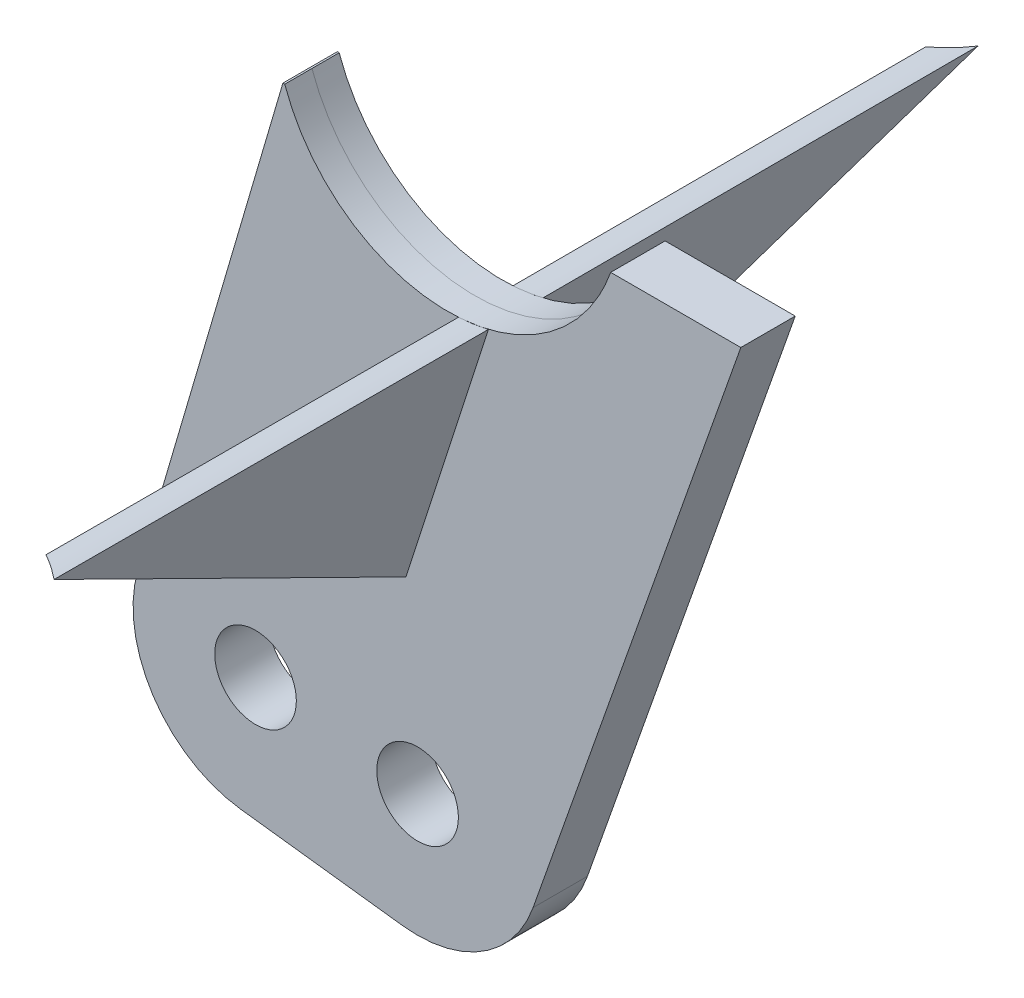
ISO-10303-21;
HEADER;
FILE_DESCRIPTION(('STEP AP214'),'2;1');
FILE_NAME('part.step','',(''),(''),'','','');
FILE_SCHEMA(('AUTOMOTIVE_DESIGN { 1 0 10303 214 1 1 1 1 }'));
ENDSEC;
DATA;
#1=APPLICATION_CONTEXT('core data for automotive mechanical design processes');
#2=APPLICATION_PROTOCOL_DEFINITION('international standard','automotive_design',2000,#1);
#3=PRODUCT_CONTEXT('',#1,'mechanical');
#4=PRODUCT('Part','Part','',(#3));
#5=PRODUCT_RELATED_PRODUCT_CATEGORY('part','',(#4));
#6=PRODUCT_DEFINITION_FORMATION('','',#4);
#7=PRODUCT_DEFINITION_CONTEXT('part definition',#1,'design');
#8=PRODUCT_DEFINITION('design','',#6,#7);
#9=PRODUCT_DEFINITION_SHAPE('','',#8);
#10=(LENGTH_UNIT() NAMED_UNIT(*) SI_UNIT(.MILLI.,.METRE.));
#11=(NAMED_UNIT(*) PLANE_ANGLE_UNIT() SI_UNIT($,.RADIAN.));
#12=(NAMED_UNIT(*) SI_UNIT($,.STERADIAN.) SOLID_ANGLE_UNIT());
#13=UNCERTAINTY_MEASURE_WITH_UNIT(LENGTH_MEASURE(1.E-05),#10,'distance_accuracy_value','');
#14=(GEOMETRIC_REPRESENTATION_CONTEXT(3) GLOBAL_UNCERTAINTY_ASSIGNED_CONTEXT((#13)) GLOBAL_UNIT_ASSIGNED_CONTEXT((#10,
#11,#12)) REPRESENTATION_CONTEXT('',''));
#15=CARTESIAN_POINT('',(0.,0.,0.));
#16=DIRECTION('',(0.,0.,1.));
#17=DIRECTION('',(1.,0.,0.));
#18=AXIS2_PLACEMENT_3D('',#15,#16,#17);
#19=CARTESIAN_POINT('',(0.,675.36294581158,2.));
#20=DIRECTION('',(0.,-1.,0.));
#21=DIRECTION('',(0.,0.,-1.));
#22=AXIS2_PLACEMENT_3D('',#19,#20,#21);
#23=PLANE('',#22);
#24=CARTESIAN_POINT('',(773.707143369989,675.36294581158,-2117.85708999697));
#25=DIRECTION('',(0.,-1.,0.));
#26=DIRECTION('',(0.,0.,1.));
#27=AXIS2_PLACEMENT_3D('',#24,#25,#26);
#28=ELLIPSE('',#27,6375.56571395792,12.7);
#29=CARTESIAN_POINT('',(785.684567710527,675.36294581158,2.));
#30=VERTEX_POINT('',#29);
#31=CARTESIAN_POINT('',(785.685971534854,675.36294581158,-1.54501167224955E-13));
#32=VERTEX_POINT('',#31);
#33=EDGE_CURVE('E59',#30,#32,#28,.F.);
#34=ORIENTED_EDGE('',*,*,#33,.F.);
#35=DIRECTION('',(-1.,0.,0.));
#36=VECTOR('',#35,1.);
#37=CARTESIAN_POINT('',(0.,675.36294581158,2.));
#38=LINE('',#37,#36);
#39=CARTESIAN_POINT('',(795.250475327084,675.36294581158,2.));
#40=VERTEX_POINT('',#39);
#41=EDGE_CURVE('E178',#40,#30,#38,.T.);
#42=ORIENTED_EDGE('',*,*,#41,.F.);
#43=DIRECTION('',(0.,0.,-1.));
#44=VECTOR('',#43,1.);
#45=CARTESIAN_POINT('',(795.250475327084,675.36294581158,2.));
#46=LINE('',#45,#44);
#47=CARTESIAN_POINT('',(795.250475327084,675.36294581158,-2.));
#48=VERTEX_POINT('',#47);
#49=EDGE_CURVE('E141',#40,#48,#46,.T.);
#50=ORIENTED_EDGE('',*,*,#49,.T.);
#51=DIRECTION('',(-1.,0.,0.));
#52=VECTOR('',#51,1.);
#53=CARTESIAN_POINT('',(0.,675.36294581158,-2.));
#54=LINE('',#53,#52);
#55=CARTESIAN_POINT('',(785.684567710527,675.36294581158,-2.));
#56=VERTEX_POINT('',#55);
#57=EDGE_CURVE('E53',#48,#56,#54,.T.);
#58=ORIENTED_EDGE('',*,*,#57,.T.);
#59=CARTESIAN_POINT('',(773.707143369989,675.36294581158,2117.85708999691));
#60=DIRECTION('',(0.,-1.,0.));
#61=DIRECTION('',(0.,0.,1.));
#62=AXIS2_PLACEMENT_3D('',#59,#60,#61);
#63=ELLIPSE('',#62,6375.56571395792,12.7);
#64=EDGE_CURVE('E116',#32,#56,#63,.F.);
#65=ORIENTED_EDGE('',*,*,#64,.F.);
#66=EDGE_LOOP('',(#34,#42,#50,#58,#65));
#67=FACE_BOUND('',#66,.T.);
#68=ADVANCED_FACE('F50',(#67),#23,.F.);
#69=CARTESIAN_POINT('',(761.728315205146,675.36294581158,0.));
#70=VERTEX_POINT('',#69);
#71=CARTESIAN_POINT('',(761.729719029473,675.36294581158,2.));
#72=VERTEX_POINT('',#71);
#73=EDGE_CURVE('E12',#70,#72,#28,.F.);
#74=ORIENTED_EDGE('',*,*,#73,.F.);
#75=CARTESIAN_POINT('',(761.729719029473,675.36294581158,-2.));
#76=VERTEX_POINT('',#75);
#77=EDGE_CURVE('E128',#76,#70,#63,.F.);
#78=ORIENTED_EDGE('',*,*,#77,.F.);
#79=CARTESIAN_POINT('',(761.593469884298,675.36294581158,-2.));
#80=VERTEX_POINT('',#79);
#81=EDGE_CURVE('E136',#76,#80,#54,.T.);
#82=ORIENTED_EDGE('',*,*,#81,.T.);
#83=DIRECTION('',(0.,0.,-1.));
#84=VECTOR('',#83,1.);
#85=CARTESIAN_POINT('',(761.593469884298,675.36294581158,2.));
#86=LINE('',#85,#84);
#87=CARTESIAN_POINT('',(761.593469884298,675.36294581158,2.));
#88=VERTEX_POINT('',#87);
#89=EDGE_CURVE('E148',#88,#80,#86,.T.);
#90=ORIENTED_EDGE('',*,*,#89,.F.);
#91=EDGE_CURVE('E182',#72,#88,#38,.T.);
#92=ORIENTED_EDGE('',*,*,#91,.F.);
#93=EDGE_LOOP('',(#74,#78,#82,#90,#92));
#94=FACE_BOUND('',#93,.T.);
#95=ADVANCED_FACE('F202',(#94),#23,.F.);
#96=CARTESIAN_POINT('',(759.582806759763,636.529342027402,2.));
#97=DIRECTION('',(0.,0.,-1.));
#98=DIRECTION('',(-1.,0.,0.));
#99=AXIS2_PLACEMENT_3D('',#96,#97,#98);
#100=CYLINDRICAL_SURFACE('',#99,9.00000000000004);
#101=CARTESIAN_POINT('',(759.582806759763,636.529342027402,-2.));
#102=DIRECTION('',(0.,0.,1.));
#103=DIRECTION('',(1.,0.,0.));
#104=AXIS2_PLACEMENT_3D('',#101,#102,#103);
#105=CIRCLE('',#104,9.00000000000004);
#106=CARTESIAN_POINT('',(750.946601349752,639.06231579673,-2.));
#107=VERTEX_POINT('',#106);
#108=CARTESIAN_POINT('',(758.485982669116,627.59642666263,-2.));
#109=VERTEX_POINT('',#108);
#110=EDGE_CURVE('E142',#107,#109,#105,.T.);
#111=ORIENTED_EDGE('',*,*,#110,.T.);
#112=DIRECTION('',(0.,0.,-1.));
#113=VECTOR('',#112,1.);
#114=CARTESIAN_POINT('',(758.485982669116,627.59642666263,2.));
#115=LINE('',#114,#113);
#116=CARTESIAN_POINT('',(758.485982669116,627.59642666263,2.));
#117=VERTEX_POINT('',#116);
#118=EDGE_CURVE('E166',#117,#109,#115,.T.);
#119=ORIENTED_EDGE('',*,*,#118,.F.);
#120=CARTESIAN_POINT('',(759.582806759763,636.529342027402,2.));
#121=DIRECTION('',(0.,0.,1.));
#122=DIRECTION('',(1.,0.,0.));
#123=AXIS2_PLACEMENT_3D('',#120,#121,#122);
#124=CIRCLE('',#123,9.00000000000004);
#125=CARTESIAN_POINT('',(750.946601349752,639.06231579673,2.));
#126=VERTEX_POINT('',#125);
#127=EDGE_CURVE('E181',#126,#117,#124,.T.);
#128=ORIENTED_EDGE('',*,*,#127,.F.);
#129=DIRECTION('',(0.,0.,-1.));
#130=VECTOR('',#129,1.);
#131=CARTESIAN_POINT('',(750.946601349752,639.06231579673,2.));
#132=LINE('',#131,#130);
#133=EDGE_CURVE('E153',#126,#107,#132,.T.);
#134=ORIENTED_EDGE('',*,*,#133,.T.);
#135=EDGE_LOOP('',(#111,#119,#128,#134));
#136=FACE_BOUND('',#135,.T.);
#137=ADVANCED_FACE('F209',(#136),#100,.T.);
#138=CARTESIAN_POINT('',(87.179796227402,710.022461996271,2.));
#139=DIRECTION('',(-0.121869343405135,-0.992546151641324,0.));
#140=DIRECTION('',(0.992546151641324,-0.121869343405135,0.));
#141=AXIS2_PLACEMENT_3D('',#138,#139,#140);
#142=PLANE('',#141);
#143=DIRECTION('',(-0.992546151641324,0.121869343405135,0.));
#144=VECTOR('',#143,1.);
#145=CARTESIAN_POINT('',(87.179796227402,710.022461996271,-2.));
#146=LINE('',#145,#144);
#147=CARTESIAN_POINT('',(770.396536488812,626.133994541769,-2.));
#148=VERTEX_POINT('',#147);
#149=EDGE_CURVE('E167',#148,#109,#146,.T.);
#150=ORIENTED_EDGE('',*,*,#149,.F.);
#151=DIRECTION('',(0.,0.,-1.));
#152=VECTOR('',#151,1.);
#153=CARTESIAN_POINT('',(770.396536488812,626.133994541769,2.));
#154=LINE('',#153,#152);
#155=CARTESIAN_POINT('',(770.396536488812,626.133994541769,2.));
#156=VERTEX_POINT('',#155);
#157=EDGE_CURVE('E163',#156,#148,#154,.T.);
#158=ORIENTED_EDGE('',*,*,#157,.F.);
#159=DIRECTION('',(-0.992546151641324,0.121869343405135,0.));
#160=VECTOR('',#159,1.);
#161=CARTESIAN_POINT('',(87.179796227402,710.022461996271,2.));
#162=LINE('',#161,#160);
#163=EDGE_CURVE('E156',#156,#117,#162,.T.);
#164=ORIENTED_EDGE('',*,*,#163,.T.);
#165=ORIENTED_EDGE('',*,*,#118,.T.);
#166=EDGE_LOOP('',(#150,#158,#164,#165));
#167=FACE_BOUND('',#166,.T.);
#168=ADVANCED_FACE('F215',(#167),#142,.T.);
#169=CARTESIAN_POINT('',(771.493360579459,635.06690990654,2.));
#170=DIRECTION('',(0.,0.,-1.));
#171=DIRECTION('',(-1.,0.,0.));
#172=AXIS2_PLACEMENT_3D('',#169,#170,#171);
#173=CYLINDRICAL_SURFACE('',#172,9.00000000000004);
#174=CARTESIAN_POINT('',(771.493360579459,635.06690990654,-2.));
#175=DIRECTION('',(0.,0.,1.));
#176=DIRECTION('',(1.,0.,0.));
#177=AXIS2_PLACEMENT_3D('',#174,#175,#176);
#178=CIRCLE('',#177,9.00000000000004);
#179=CARTESIAN_POINT('',(779.980834721333,632.073119217295,-2.));
#180=VERTEX_POINT('',#179);
#181=EDGE_CURVE('E164',#148,#180,#178,.T.);
#182=ORIENTED_EDGE('',*,*,#181,.T.);
#183=DIRECTION('',(0.,0.,-1.));
#184=VECTOR('',#183,1.);
#185=CARTESIAN_POINT('',(779.980834721333,632.073119217295,2.));
#186=LINE('',#185,#184);
#187=CARTESIAN_POINT('',(779.980834721333,632.073119217295,2.));
#188=VERTEX_POINT('',#187);
#189=EDGE_CURVE('E146',#188,#180,#186,.T.);
#190=ORIENTED_EDGE('',*,*,#189,.F.);
#191=CARTESIAN_POINT('',(771.493360579459,635.06690990654,2.));
#192=DIRECTION('',(0.,0.,1.));
#193=DIRECTION('',(1.,0.,0.));
#194=AXIS2_PLACEMENT_3D('',#191,#192,#193);
#195=CIRCLE('',#194,9.00000000000004);
#196=EDGE_CURVE('E184',#156,#188,#195,.T.);
#197=ORIENTED_EDGE('',*,*,#196,.F.);
#198=ORIENTED_EDGE('',*,*,#157,.T.);
#199=EDGE_LOOP('',(#182,#190,#197,#198));
#200=FACE_BOUND('',#199,.T.);
#201=ADVANCED_FACE('F218',(#200),#173,.T.);
#202=CARTESIAN_POINT('',(495.393175778991,-174.740264579522,2.));
#203=DIRECTION('',(-0.943052682430485,0.332643409916184,0.));
#204=DIRECTION('',(-0.332643409916184,-0.943052682430485,0.));
#205=AXIS2_PLACEMENT_3D('',#202,#203,#204);
#206=PLANE('',#205);
#207=DIRECTION('',(0.332643409916184,0.943052682430485,0.));
#208=VECTOR('',#207,1.);
#209=CARTESIAN_POINT('',(495.393175778991,-174.740264579522,-2.));
#210=LINE('',#209,#208);
#211=EDGE_CURVE('E161',#180,#48,#210,.T.);
#212=ORIENTED_EDGE('',*,*,#211,.T.);
#213=ORIENTED_EDGE('',*,*,#49,.F.);
#214=DIRECTION('',(0.332643409916184,0.943052682430485,0.));
#215=VECTOR('',#214,1.);
#216=CARTESIAN_POINT('',(495.393175778991,-174.740264579522,2.));
#217=LINE('',#216,#215);
#218=EDGE_CURVE('E170',#188,#40,#217,.T.);
#219=ORIENTED_EDGE('',*,*,#218,.F.);
#220=ORIENTED_EDGE('',*,*,#189,.T.);
#221=EDGE_LOOP('',(#212,#213,#219,#220));
#222=FACE_BOUND('',#221,.T.);
#223=ADVANCED_FACE('F222',(#222),#206,.F.);
#224=CARTESIAN_POINT('',(518.876123985577,-152.184848459354,2.));
#225=DIRECTION('',(0.959578378890051,-0.281441529925386,0.));
#226=DIRECTION('',(0.281441529925386,0.959578378890051,0.));
#227=AXIS2_PLACEMENT_3D('',#224,#225,#226);
#228=PLANE('',#227);
#229=DIRECTION('',(-0.281441529925386,-0.959578378890051,0.));
#230=VECTOR('',#229,1.);
#231=CARTESIAN_POINT('',(518.876123985577,-152.184848459354,-2.));
#232=LINE('',#231,#230);
#233=EDGE_CURVE('E152',#80,#107,#232,.T.);
#234=ORIENTED_EDGE('',*,*,#233,.T.);
#235=ORIENTED_EDGE('',*,*,#133,.F.);
#236=DIRECTION('',(-0.281441529925386,-0.959578378890051,0.));
#237=VECTOR('',#236,1.);
#238=CARTESIAN_POINT('',(518.876123985577,-152.184848459354,2.));
#239=LINE('',#238,#237);
#240=EDGE_CURVE('E179',#88,#126,#239,.T.);
#241=ORIENTED_EDGE('',*,*,#240,.F.);
#242=ORIENTED_EDGE('',*,*,#89,.T.);
#243=EDGE_LOOP('',(#234,#235,#241,#242));
#244=FACE_BOUND('',#243,.T.);
#245=ADVANCED_FACE('F204',(#244),#228,.F.);
#246=CARTESIAN_POINT('',(759.582806759763,636.529342027402,2.));
#247=DIRECTION('',(0.,0.,-1.));
#248=DIRECTION('',(-1.,0.,0.));
#249=AXIS2_PLACEMENT_3D('',#246,#247,#248);
#250=CYLINDRICAL_SURFACE('',#249,3.00000000000005);
#251=CARTESIAN_POINT('',(759.582806759763,636.529342027402,2.));
#252=DIRECTION('',(0.,0.,1.));
#253=DIRECTION('',(1.,0.,0.));
#254=AXIS2_PLACEMENT_3D('',#251,#252,#253);
#255=CIRCLE('',#254,3.00000000000005);
#256=CARTESIAN_POINT('',(762.582806759763,636.529342027402,2.));
#257=VERTEX_POINT('',#256);
#258=EDGE_CURVE('E151',#257,#257,#255,.T.);
#259=ORIENTED_EDGE('',*,*,#258,.T.);
#260=EDGE_LOOP('',(#259));
#261=FACE_BOUND('',#260,.T.);
#262=CARTESIAN_POINT('',(759.582806759763,636.529342027402,-2.));
#263=DIRECTION('',(0.,0.,1.));
#264=DIRECTION('',(1.,0.,0.));
#265=AXIS2_PLACEMENT_3D('',#262,#263,#264);
#266=CIRCLE('',#265,3.00000000000005);
#267=CARTESIAN_POINT('',(762.582806759763,636.529342027402,-2.));
#268=VERTEX_POINT('',#267);
#269=EDGE_CURVE('E159',#268,#268,#266,.T.);
#270=ORIENTED_EDGE('',*,*,#269,.F.);
#271=EDGE_LOOP('',(#270));
#272=FACE_BOUND('',#271,.T.);
#273=ADVANCED_FACE('F244',(#261,#272),#250,.F.);
#274=CARTESIAN_POINT('',(771.493360579459,635.06690990654,2.));
#275=DIRECTION('',(0.,0.,-1.));
#276=DIRECTION('',(-1.,0.,0.));
#277=AXIS2_PLACEMENT_3D('',#274,#275,#276);
#278=CYLINDRICAL_SURFACE('',#277,3.00000000000005);
#279=CARTESIAN_POINT('',(771.493360579459,635.06690990654,2.));
#280=DIRECTION('',(0.,0.,1.));
#281=DIRECTION('',(1.,0.,0.));
#282=AXIS2_PLACEMENT_3D('',#279,#280,#281);
#283=CIRCLE('',#282,3.00000000000005);
#284=CARTESIAN_POINT('',(774.493360579459,635.06690990654,2.));
#285=VERTEX_POINT('',#284);
#286=EDGE_CURVE('E175',#285,#285,#283,.T.);
#287=ORIENTED_EDGE('',*,*,#286,.T.);
#288=EDGE_LOOP('',(#287));
#289=FACE_BOUND('',#288,.T.);
#290=CARTESIAN_POINT('',(771.493360579459,635.06690990654,-2.));
#291=DIRECTION('',(0.,0.,1.));
#292=DIRECTION('',(1.,0.,0.));
#293=AXIS2_PLACEMENT_3D('',#290,#291,#292);
#294=CIRCLE('',#293,3.00000000000005);
#295=CARTESIAN_POINT('',(774.493360579459,635.06690990654,-2.));
#296=VERTEX_POINT('',#295);
#297=EDGE_CURVE('E126',#296,#296,#294,.T.);
#298=ORIENTED_EDGE('',*,*,#297,.F.);
#299=EDGE_LOOP('',(#298));
#300=FACE_BOUND('',#299,.T.);
#301=ADVANCED_FACE('F252',(#289,#300),#278,.F.);
#302=CARTESIAN_POINT('',(0.,0.,2.));
#303=DIRECTION('',(0.,0.,1.));
#304=DIRECTION('',(1.,0.,0.));
#305=AXIS2_PLACEMENT_3D('',#302,#303,#304);
#306=PLANE('',#305);
#307=ORIENTED_EDGE('',*,*,#258,.F.);
#308=EDGE_LOOP('',(#307));
#309=FACE_BOUND('',#308,.T.);
#310=ORIENTED_EDGE('',*,*,#41,.T.);
#311=CARTESIAN_POINT('',(773.70714337,679.585667318095,2.));
#312=DIRECTION('',(0.,0.,1.));
#313=DIRECTION('',(2.57561310605937E-12,1.,0.));
#314=AXIS2_PLACEMENT_3D('',#311,#312,#313);
#315=ELLIPSE('',#314,12.7000251967778,12.7);
#316=EDGE_CURVE('E66',#30,#72,#315,.F.);
#317=ORIENTED_EDGE('',*,*,#316,.T.);
#318=ORIENTED_EDGE('',*,*,#91,.T.);
#319=ORIENTED_EDGE('',*,*,#240,.T.);
#320=ORIENTED_EDGE('',*,*,#127,.T.);
#321=ORIENTED_EDGE('',*,*,#163,.F.);
#322=ORIENTED_EDGE('',*,*,#196,.T.);
#323=ORIENTED_EDGE('',*,*,#218,.T.);
#324=EDGE_LOOP('',(#310,#317,#318,#319,#320,#321,#322,#323));
#325=FACE_BOUND('',#324,.T.);
#326=ORIENTED_EDGE('',*,*,#286,.F.);
#327=EDGE_LOOP('',(#326));
#328=FACE_BOUND('',#327,.T.);
#329=ADVANCED_FACE('F196',(#309,#325,#328),#306,.T.);
#330=CARTESIAN_POINT('',(0.,0.,-2.));
#331=DIRECTION('',(0.,0.,1.));
#332=DIRECTION('',(1.,0.,0.));
#333=AXIS2_PLACEMENT_3D('',#330,#331,#332);
#334=PLANE('',#333);
#335=CARTESIAN_POINT('',(773.70714337,679.585667318095,-2.));
#336=DIRECTION('',(0.,0.,1.));
#337=DIRECTION('',(-2.57551970347908E-12,-1.,0.));
#338=AXIS2_PLACEMENT_3D('',#335,#336,#337);
#339=ELLIPSE('',#338,12.7000251967778,12.7);
#340=EDGE_CURVE('E120',#56,#76,#339,.F.);
#341=ORIENTED_EDGE('',*,*,#340,.F.);
#342=ORIENTED_EDGE('',*,*,#57,.F.);
#343=ORIENTED_EDGE('',*,*,#211,.F.);
#344=ORIENTED_EDGE('',*,*,#181,.F.);
#345=ORIENTED_EDGE('',*,*,#149,.T.);
#346=ORIENTED_EDGE('',*,*,#110,.F.);
#347=ORIENTED_EDGE('',*,*,#233,.F.);
#348=ORIENTED_EDGE('',*,*,#81,.F.);
#349=EDGE_LOOP('',(#341,#342,#343,#344,#345,#346,#347,#348));
#350=FACE_BOUND('',#349,.T.);
#351=ORIENTED_EDGE('',*,*,#269,.T.);
#352=EDGE_LOOP('',(#351));
#353=FACE_BOUND('',#352,.T.);
#354=ORIENTED_EDGE('',*,*,#297,.T.);
#355=EDGE_LOOP('',(#354));
#356=FACE_BOUND('',#355,.T.);
#357=ADVANCED_FACE('F132',(#350,#353,#356),#334,.F.);
#358=CARTESIAN_POINT('',(773.707143370001,679.840323836785,-129.840641592359));
#359=DIRECTION('',(0.,-0.0019919800955382,0.999998016005682));
#360=DIRECTION('',(0.,-0.999998016005682,-0.0019919800955382));
#361=AXIS2_PLACEMENT_3D('',#358,#359,#360);
#362=CYLINDRICAL_SURFACE('',#361,12.7);
#363=ORIENTED_EDGE('',*,*,#64,.T.);
#364=ORIENTED_EDGE('',*,*,#340,.T.);
#365=ORIENTED_EDGE('',*,*,#77,.T.);
#366=CARTESIAN_POINT('',(773.70714337,679.58168335,0.));
#367=DIRECTION('',(0.,0.,1.));
#368=DIRECTION('',(-7.3888044120618E-12,-1.,0.));
#369=AXIS2_PLACEMENT_3D('',#366,#367,#368);
#370=ELLIPSE('',#369,12.7000251967778,12.7);
#371=EDGE_CURVE('E123',#70,#32,#370,.T.);
#372=ORIENTED_EDGE('',*,*,#371,.T.);
#373=EDGE_LOOP('',(#363,#364,#365,#372));
#374=FACE_BOUND('',#373,.T.);
#375=ADVANCED_FACE('F118',(#374),#362,.F.);
#376=CARTESIAN_POINT('',(773.70714337,679.58168335,0.));
#377=DIRECTION('',(0.,0.0019919800955382,0.999998016005682));
#378=DIRECTION('',(0.,-0.999998016005681,0.0019919800955382));
#379=AXIS2_PLACEMENT_3D('',#376,#377,#378);
#380=CYLINDRICAL_SURFACE('',#379,12.7);
#381=ORIENTED_EDGE('',*,*,#33,.T.);
#382=ORIENTED_EDGE('',*,*,#371,.F.);
#383=ORIENTED_EDGE('',*,*,#73,.T.);
#384=ORIENTED_EDGE('',*,*,#316,.F.);
#385=EDGE_LOOP('',(#381,#382,#383,#384));
#386=FACE_BOUND('',#385,.T.);
#387=ADVANCED_FACE('F223',(#386),#380,.F.);
#388=CLOSED_SHELL('',(#68,#95,#137,#168,#201,#223,#245,#273,#301,#329,#357,#375,#387));
#389=MANIFOLD_SOLID_BREP('B2',#388);
#390=CARTESIAN_POINT('',(508.389805267096,-164.085686043004,0.));
#391=DIRECTION('',(-0.951659942943947,0.307153630933973,0.));
#392=DIRECTION('',(-0.307153630933973,-0.951659942943947,0.));
#393=AXIS2_PLACEMENT_3D('',#390,#391,#392);
#394=PLANE('',#393);
#395=CARTESIAN_POINT('',(773.707143369945,657.952074257064,-10858.3244523188));
#396=DIRECTION('',(-0.951659942943947,0.307153630933973,0.));
#397=DIRECTION('',(0.000582267458121692,0.00180405035190133,0.999998203181853));
#398=AXIS2_PLACEMENT_3D('',#395,#396,#397);
#399=ELLIPSE('',#398,20756.9277127618,12.7);
#400=CARTESIAN_POINT('',(776.728752885131,667.313984549568,33.9539869910128));
#401=VERTEX_POINT('',#400);
#402=CARTESIAN_POINT('',(776.706452712763,667.244891500926,2.));
#403=VERTEX_POINT('',#402);
#404=EDGE_CURVE('E48',#401,#403,#399,.F.);
#405=ORIENTED_EDGE('',*,*,#404,.F.);
#406=DIRECTION('',(0.161873338255139,0.501535245992736,0.84985847021086));
#407=VECTOR('',#406,1.);
#408=CARTESIAN_POINT('',(777.653597654606,670.179448707926,38.8095559774868));
#409=LINE('',#408,#407);
#410=CARTESIAN_POINT('',(770.642447075278,648.456667375322,2.));
#411=VERTEX_POINT('',#410);
#412=EDGE_CURVE('E417',#411,#401,#409,.T.);
#413=ORIENTED_EDGE('',*,*,#412,.F.);
#414=DIRECTION('',(-0.307153630933973,-0.951659942943947,0.));
#415=VECTOR('',#414,1.);
#416=CARTESIAN_POINT('',(770.642447075278,648.456667375322,2.));
#417=LINE('',#416,#415);
#418=EDGE_CURVE('E413',#403,#411,#417,.T.);
#419=ORIENTED_EDGE('',*,*,#418,.F.);
#420=EDGE_LOOP('',(#405,#413,#419));
#421=FACE_BOUND('',#420,.T.);
#422=ADVANCED_FACE('F372',(#421),#394,.F.);
#423=CARTESIAN_POINT('',(506.486485381208,-163.471378781136,0.));
#424=DIRECTION('',(-0.951659942943947,0.307153630933973,0.));
#425=DIRECTION('',(-0.307153630933973,-0.951659942943947,0.));
#426=AXIS2_PLACEMENT_3D('',#423,#424,#425);
#427=PLANE('',#426);
#428=DIRECTION('',(0.161873338255139,0.501535245992736,0.84985847021086));
#429=VECTOR('',#428,1.);
#430=CARTESIAN_POINT('',(775.750277768718,670.793755969794,38.8095559774868));
#431=LINE('',#430,#429);
#432=CARTESIAN_POINT('',(768.739127189391,649.07097463719,2.));
#433=VERTEX_POINT('',#432);
#434=CARTESIAN_POINT('',(774.516751400239,666.97189773593,32.3333638894013));
#435=VERTEX_POINT('',#434);
#436=EDGE_CURVE('E422',#433,#435,#431,.T.);
#437=ORIENTED_EDGE('',*,*,#436,.T.);
#438=CARTESIAN_POINT('',(773.707143369961,664.46347376074,-7589.52342379362));
#439=DIRECTION('',(-0.951659942943947,0.307153630933973,0.));
#440=DIRECTION('',(0.000582267458121692,0.00180405035190133,0.999998203181853));
#441=AXIS2_PLACEMENT_3D('',#438,#439,#440);
#442=ELLIPSE('',#441,20756.9277127618,12.7);
#443=CARTESIAN_POINT('',(774.496843979437,666.910218195019,2.));
#444=VERTEX_POINT('',#443);
#445=EDGE_CURVE('E415',#435,#444,#442,.F.);
#446=ORIENTED_EDGE('',*,*,#445,.T.);
#447=DIRECTION('',(-0.307153630933973,-0.951659942943947,0.));
#448=VECTOR('',#447,1.);
#449=CARTESIAN_POINT('',(768.739127189391,649.07097463719,2.));
#450=LINE('',#449,#448);
#451=EDGE_CURVE('E395',#444,#433,#450,.T.);
#452=ORIENTED_EDGE('',*,*,#451,.T.);
#453=EDGE_LOOP('',(#437,#446,#452));
#454=FACE_BOUND('',#453,.T.);
#455=ADVANCED_FACE('F427',(#454),#427,.T.);
#456=CARTESIAN_POINT('',(775.750277768718,670.793755969794,38.8095559774868));
#457=DIRECTION('',(0.261037114905259,0.808776263271297,-0.527010987182295));
#458=DIRECTION('',(0.,0.545939379681137,0.837824679580027));
#459=AXIS2_PLACEMENT_3D('',#456,#457,#458);
#460=PLANE('',#459);
#461=CARTESIAN_POINT('',(773.70714337,679.684153374455,51.441187281278));
#462=DIRECTION('',(0.261037114905259,0.808776263271297,-0.527010987182295));
#463=DIRECTION('',(0.16118896519646,0.501755988091254,0.84985825048267));
#464=AXIS2_PLACEMENT_3D('',#461,#462,#463);
#465=ELLIPSE('',#464,24.1721111239144,12.7);
#466=EDGE_CURVE('E386',#435,#401,#465,.F.);
#467=ORIENTED_EDGE('',*,*,#466,.F.);
#468=ORIENTED_EDGE('',*,*,#436,.F.);
#469=DIRECTION('',(0.951659942943947,-0.307153630933975,0.));
#470=VECTOR('',#469,1.);
#471=CARTESIAN_POINT('',(768.739127189391,649.07097463719,2.));
#472=LINE('',#471,#470);
#473=EDGE_CURVE('E380',#433,#411,#472,.T.);
#474=ORIENTED_EDGE('',*,*,#473,.T.);
#475=ORIENTED_EDGE('',*,*,#412,.T.);
#476=EDGE_LOOP('',(#467,#468,#474,#475));
#477=FACE_BOUND('',#476,.T.);
#478=ADVANCED_FACE('F428',(#477),#460,.F.);
#479=CARTESIAN_POINT('',(768.739127189391,649.07097463719,2.));
#480=DIRECTION('',(0.,0.,1.));
#481=DIRECTION('',(1.,0.,0.));
#482=AXIS2_PLACEMENT_3D('',#479,#480,#481);
#483=PLANE('',#482);
#484=CARTESIAN_POINT('',(773.70714337,679.585667318095,2.));
#485=DIRECTION('',(0.,0.,1.));
#486=DIRECTION('',(2.57561310605937E-12,1.,0.));
#487=AXIS2_PLACEMENT_3D('',#484,#485,#486);
#488=ELLIPSE('',#487,12.7000251967778,12.7);
#489=EDGE_CURVE('E407',#403,#444,#488,.F.);
#490=ORIENTED_EDGE('',*,*,#489,.F.);
#491=ORIENTED_EDGE('',*,*,#418,.T.);
#492=ORIENTED_EDGE('',*,*,#473,.F.);
#493=ORIENTED_EDGE('',*,*,#451,.F.);
#494=EDGE_LOOP('',(#490,#491,#492,#493));
#495=FACE_BOUND('',#494,.T.);
#496=ADVANCED_FACE('F374',(#495),#483,.F.);
#497=CARTESIAN_POINT('',(773.70714337,679.58168335,0.));
#498=DIRECTION('',(0.,0.0019919800955382,0.999998016005682));
#499=DIRECTION('',(0.,-0.999998016005681,0.0019919800955382));
#500=AXIS2_PLACEMENT_3D('',#497,#498,#499);
#501=CYLINDRICAL_SURFACE('',#500,12.7);
#502=ORIENTED_EDGE('',*,*,#466,.T.);
#503=ORIENTED_EDGE('',*,*,#404,.T.);
#504=ORIENTED_EDGE('',*,*,#489,.T.);
#505=ORIENTED_EDGE('',*,*,#445,.F.);
#506=EDGE_LOOP('',(#502,#503,#504,#505));
#507=FACE_BOUND('',#506,.T.);
#508=ADVANCED_FACE('F406',(#507),#501,.F.);
#509=CLOSED_SHELL('',(#422,#455,#478,#496,#508));
#510=MANIFOLD_SOLID_BREP('B6',#509);
#511=CARTESIAN_POINT('',(508.389805267096,-164.085686043004,0.));
#512=DIRECTION('',(-0.951659942943947,0.307153630933973,0.));
#513=DIRECTION('',(-0.307153630933973,-0.951659942943947,0.));
#514=AXIS2_PLACEMENT_3D('',#511,#512,#513);
#515=PLANE('',#514);
#516=CARTESIAN_POINT('',(773.707143369944,657.952074257063,10858.3244523191));
#517=DIRECTION('',(-0.951659942943947,0.307153630933973,0.));
#518=DIRECTION('',(-0.000582267458121692,-0.00180405035190133,0.999998203181853));
#519=AXIS2_PLACEMENT_3D('',#516,#517,#518);
#520=ELLIPSE('',#519,20756.9277127618,12.7);
#521=CARTESIAN_POINT('',(776.706452712763,667.244891500926,-2.));
#522=VERTEX_POINT('',#521);
#523=CARTESIAN_POINT('',(776.728752885054,667.313984549331,-33.9539869906098));
#524=VERTEX_POINT('',#523);
#525=EDGE_CURVE('E370',#522,#524,#520,.F.);
#526=ORIENTED_EDGE('',*,*,#525,.F.);
#527=DIRECTION('',(0.307153630933973,0.951659942943947,0.));
#528=VECTOR('',#527,1.);
#529=CARTESIAN_POINT('',(770.642447075278,648.456667375322,-2.));
#530=LINE('',#529,#528);
#531=CARTESIAN_POINT('',(770.642447075278,648.456667375322,-2.));
#532=VERTEX_POINT('',#531);
#533=EDGE_CURVE('E517',#532,#522,#530,.T.);
#534=ORIENTED_EDGE('',*,*,#533,.F.);
#535=DIRECTION('',(-0.161873338255139,-0.501535245992735,0.84985847021086));
#536=VECTOR('',#535,1.);
#537=CARTESIAN_POINT('',(777.653597654606,670.179448707926,-38.8095559774868));
#538=LINE('',#537,#536);
#539=EDGE_CURVE('E514',#524,#532,#538,.T.);
#540=ORIENTED_EDGE('',*,*,#539,.F.);
#541=EDGE_LOOP('',(#526,#534,#540));
#542=FACE_BOUND('',#541,.T.);
#543=ADVANCED_FACE('F472',(#542),#515,.F.);
#544=CARTESIAN_POINT('',(506.486485381208,-163.471378781136,0.));
#545=DIRECTION('',(-0.951659942943947,0.307153630933973,0.));
#546=DIRECTION('',(-0.307153630933973,-0.951659942943947,0.));
#547=AXIS2_PLACEMENT_3D('',#544,#545,#546);
#548=PLANE('',#547);
#549=DIRECTION('',(0.307153630933973,0.951659942943947,0.));
#550=VECTOR('',#549,1.);
#551=CARTESIAN_POINT('',(768.739127189391,649.07097463719,-2.));
#552=LINE('',#551,#550);
#553=CARTESIAN_POINT('',(768.739127189391,649.07097463719,-2.));
#554=VERTEX_POINT('',#553);
#555=CARTESIAN_POINT('',(774.496843979437,666.910218195019,-2.));
#556=VERTEX_POINT('',#555);
#557=EDGE_CURVE('E523',#554,#556,#552,.T.);
#558=ORIENTED_EDGE('',*,*,#557,.T.);
#559=CARTESIAN_POINT('',(773.707143369961,664.46347376074,7589.52342379385));
#560=DIRECTION('',(-0.951659942943947,0.307153630933973,0.));
#561=DIRECTION('',(-0.000582267458121692,-0.00180405035190133,0.999998203181853));
#562=AXIS2_PLACEMENT_3D('',#559,#560,#561);
#563=ELLIPSE('',#562,20756.9277127618,12.7);
#564=CARTESIAN_POINT('',(774.516751400239,666.97189773593,-32.3333638894012));
#565=VERTEX_POINT('',#564);
#566=EDGE_CURVE('E515',#556,#565,#563,.F.);
#567=ORIENTED_EDGE('',*,*,#566,.T.);
#568=DIRECTION('',(-0.161873338255139,-0.501535245992735,0.84985847021086));
#569=VECTOR('',#568,1.);
#570=CARTESIAN_POINT('',(775.750277768718,670.793755969794,-38.8095559774868));
#571=LINE('',#570,#569);
#572=EDGE_CURVE('E495',#565,#554,#571,.T.);
#573=ORIENTED_EDGE('',*,*,#572,.T.);
#574=EDGE_LOOP('',(#558,#567,#573));
#575=FACE_BOUND('',#574,.T.);
#576=ADVANCED_FACE('F527',(#575),#548,.T.);
#577=CARTESIAN_POINT('',(768.739127189391,649.07097463719,-2.));
#578=DIRECTION('',(0.,0.,-1.));
#579=DIRECTION('',(-1.,0.,0.));
#580=AXIS2_PLACEMENT_3D('',#577,#578,#579);
#581=PLANE('',#580);
#582=CARTESIAN_POINT('',(773.70714337,679.585667318095,-2.));
#583=DIRECTION('',(0.,0.,-1.));
#584=DIRECTION('',(-2.57551970347908E-12,-1.,0.));
#585=AXIS2_PLACEMENT_3D('',#582,#583,#584);
#586=ELLIPSE('',#585,12.7000251967778,12.7);
#587=EDGE_CURVE('E486',#556,#522,#586,.F.);
#588=ORIENTED_EDGE('',*,*,#587,.F.);
#589=ORIENTED_EDGE('',*,*,#557,.F.);
#590=DIRECTION('',(0.951659942943947,-0.307153630933975,0.));
#591=VECTOR('',#590,1.);
#592=CARTESIAN_POINT('',(768.739127189391,649.07097463719,-2.));
#593=LINE('',#592,#591);
#594=EDGE_CURVE('E480',#554,#532,#593,.T.);
#595=ORIENTED_EDGE('',*,*,#594,.T.);
#596=ORIENTED_EDGE('',*,*,#533,.T.);
#597=EDGE_LOOP('',(#588,#589,#595,#596));
#598=FACE_BOUND('',#597,.T.);
#599=ADVANCED_FACE('F528',(#598),#581,.F.);
#600=CARTESIAN_POINT('',(775.750277768718,670.793755969794,-38.8095559774868));
#601=DIRECTION('',(0.261037114905259,0.808776263271297,0.527010987182294));
#602=DIRECTION('',(0.,-0.545939379681137,0.837824679580027));
#603=AXIS2_PLACEMENT_3D('',#600,#601,#602);
#604=PLANE('',#603);
#605=CARTESIAN_POINT('',(773.70714337,679.684153374455,-51.4411872812779));
#606=DIRECTION('',(0.261037114905259,0.808776263271297,0.527010987182294));
#607=DIRECTION('',(-0.161188965196459,-0.501755988091253,0.84985825048267));
#608=AXIS2_PLACEMENT_3D('',#605,#606,#607);
#609=ELLIPSE('',#608,24.1721111239145,12.7);
#610=EDGE_CURVE('E507',#524,#565,#609,.F.);
#611=ORIENTED_EDGE('',*,*,#610,.F.);
#612=ORIENTED_EDGE('',*,*,#539,.T.);
#613=ORIENTED_EDGE('',*,*,#594,.F.);
#614=ORIENTED_EDGE('',*,*,#572,.F.);
#615=EDGE_LOOP('',(#611,#612,#613,#614));
#616=FACE_BOUND('',#615,.T.);
#617=ADVANCED_FACE('F474',(#616),#604,.F.);
#618=CARTESIAN_POINT('',(773.707143370001,679.840323836785,-129.840641592359));
#619=DIRECTION('',(0.,-0.0019919800955382,0.999998016005682));
#620=DIRECTION('',(0.,-0.999998016005682,-0.0019919800955382));
#621=AXIS2_PLACEMENT_3D('',#618,#619,#620);
#622=CYLINDRICAL_SURFACE('',#621,12.7);
#623=ORIENTED_EDGE('',*,*,#587,.T.);
#624=ORIENTED_EDGE('',*,*,#525,.T.);
#625=ORIENTED_EDGE('',*,*,#610,.T.);
#626=ORIENTED_EDGE('',*,*,#566,.F.);
#627=EDGE_LOOP('',(#623,#624,#625,#626));
#628=FACE_BOUND('',#627,.T.);
#629=ADVANCED_FACE('F506',(#628),#622,.F.);
#630=CLOSED_SHELL('',(#543,#576,#599,#617,#629));
#631=MANIFOLD_SOLID_BREP('B42',#630);
#632=ADVANCED_BREP_SHAPE_REPRESENTATION('',(#18,#389,#510,#631),#14);
#633=SHAPE_DEFINITION_REPRESENTATION(#9,#632);
ENDSEC;
END-ISO-10303-21;
